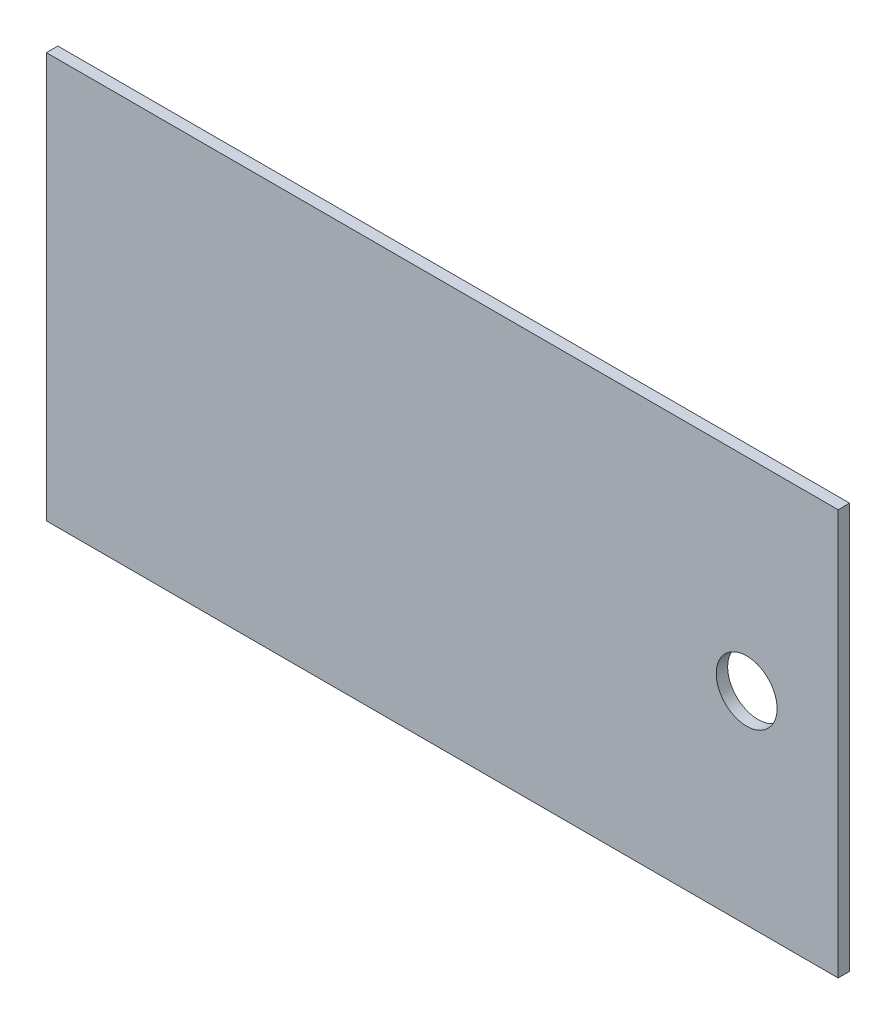
ISO-10303-21;
HEADER;
FILE_DESCRIPTION(('STEP AP214'),'2;1');
FILE_NAME('part.step','',(''),(''),'','','');
FILE_SCHEMA(('AUTOMOTIVE_DESIGN { 1 0 10303 214 1 1 1 1 }'));
ENDSEC;
DATA;
#1=APPLICATION_CONTEXT('core data for automotive mechanical design processes');
#2=APPLICATION_PROTOCOL_DEFINITION('international standard','automotive_design',2000,#1);
#3=PRODUCT_CONTEXT('',#1,'mechanical');
#4=PRODUCT('Part','Part','',(#3));
#5=PRODUCT_RELATED_PRODUCT_CATEGORY('part','',(#4));
#6=PRODUCT_DEFINITION_FORMATION('','',#4);
#7=PRODUCT_DEFINITION_CONTEXT('part definition',#1,'design');
#8=PRODUCT_DEFINITION('design','',#6,#7);
#9=PRODUCT_DEFINITION_SHAPE('','',#8);
#10=(LENGTH_UNIT() NAMED_UNIT(*) SI_UNIT(.MILLI.,.METRE.));
#11=(NAMED_UNIT(*) PLANE_ANGLE_UNIT() SI_UNIT($,.RADIAN.));
#12=(NAMED_UNIT(*) SI_UNIT($,.STERADIAN.) SOLID_ANGLE_UNIT());
#13=UNCERTAINTY_MEASURE_WITH_UNIT(LENGTH_MEASURE(1.E-05),#10,'distance_accuracy_value','');
#14=(GEOMETRIC_REPRESENTATION_CONTEXT(3) GLOBAL_UNCERTAINTY_ASSIGNED_CONTEXT((#13)) GLOBAL_UNIT_ASSIGNED_CONTEXT((#10,
#11,#12)) REPRESENTATION_CONTEXT('',''));
#15=CARTESIAN_POINT('',(0.,0.,0.));
#16=DIRECTION('',(0.,0.,1.));
#17=DIRECTION('',(1.,0.,0.));
#18=AXIS2_PLACEMENT_3D('',#15,#16,#17);
#19=CARTESIAN_POINT('',(-161.397494343139,-62.3625216291761,2.5));
#20=DIRECTION('',(0.,1.,0.));
#21=DIRECTION('',(0.,0.,1.));
#22=AXIS2_PLACEMENT_3D('',#19,#20,#21);
#23=PLANE('',#22);
#24=DIRECTION('',(1.,0.,0.));
#25=VECTOR('',#24,1.);
#26=CARTESIAN_POINT('',(-161.397494343139,-62.3625216291761,0.));
#27=LINE('',#26,#25);
#28=CARTESIAN_POINT('',(-161.397494343139,-62.3625216291761,0.));
#29=VERTEX_POINT('',#28);
#30=CARTESIAN_POINT('',(11.6025056568615,-62.3625216291761,0.));
#31=VERTEX_POINT('',#30);
#32=EDGE_CURVE('E99',#29,#31,#27,.T.);
#33=ORIENTED_EDGE('',*,*,#32,.T.);
#34=DIRECTION('',(0.,0.,-1.));
#35=VECTOR('',#34,1.);
#36=CARTESIAN_POINT('',(11.6025056568615,-62.3625216291761,2.5));
#37=LINE('',#36,#35);
#38=CARTESIAN_POINT('',(11.6025056568615,-62.3625216291761,2.5));
#39=VERTEX_POINT('',#38);
#40=EDGE_CURVE('E11',#39,#31,#37,.T.);
#41=ORIENTED_EDGE('',*,*,#40,.F.);
#42=DIRECTION('',(1.,0.,0.));
#43=VECTOR('',#42,1.);
#44=CARTESIAN_POINT('',(-161.397494343139,-62.3625216291761,2.5));
#45=LINE('',#44,#43);
#46=CARTESIAN_POINT('',(-161.397494343139,-62.3625216291761,2.5));
#47=VERTEX_POINT('',#46);
#48=EDGE_CURVE('E75',#47,#39,#45,.T.);
#49=ORIENTED_EDGE('',*,*,#48,.F.);
#50=DIRECTION('',(0.,0.,-1.));
#51=VECTOR('',#50,1.);
#52=CARTESIAN_POINT('',(-161.397494343139,-62.3625216291761,2.5));
#53=LINE('',#52,#51);
#54=EDGE_CURVE('E95',#47,#29,#53,.T.);
#55=ORIENTED_EDGE('',*,*,#54,.T.);
#56=EDGE_LOOP('',(#33,#41,#49,#55));
#57=FACE_BOUND('',#56,.T.);
#58=ADVANCED_FACE('F35',(#57),#23,.F.);
#59=CARTESIAN_POINT('',(11.6025056568615,26.2374783708239,2.5));
#60=DIRECTION('',(1.,0.,0.));
#61=DIRECTION('',(0.,1.,0.));
#62=AXIS2_PLACEMENT_3D('',#59,#60,#61);
#63=PLANE('',#62);
#64=DIRECTION('',(0.,-1.,0.));
#65=VECTOR('',#64,1.);
#66=CARTESIAN_POINT('',(11.6025056568615,26.2374783708239,0.));
#67=LINE('',#66,#65);
#68=CARTESIAN_POINT('',(11.6025056568615,26.2374783708239,0.));
#69=VERTEX_POINT('',#68);
#70=EDGE_CURVE('E84',#69,#31,#67,.T.);
#71=ORIENTED_EDGE('',*,*,#70,.F.);
#72=DIRECTION('',(0.,0.,-1.));
#73=VECTOR('',#72,1.);
#74=CARTESIAN_POINT('',(11.6025056568615,26.2374783708239,2.5));
#75=LINE('',#74,#73);
#76=CARTESIAN_POINT('',(11.6025056568615,26.2374783708239,2.5));
#77=VERTEX_POINT('',#76);
#78=EDGE_CURVE('E44',#77,#69,#75,.T.);
#79=ORIENTED_EDGE('',*,*,#78,.F.);
#80=DIRECTION('',(0.,-1.,0.));
#81=VECTOR('',#80,1.);
#82=CARTESIAN_POINT('',(11.6025056568615,26.2374783708239,2.5));
#83=LINE('',#82,#81);
#84=EDGE_CURVE('E82',#77,#39,#83,.T.);
#85=ORIENTED_EDGE('',*,*,#84,.T.);
#86=ORIENTED_EDGE('',*,*,#40,.T.);
#87=EDGE_LOOP('',(#71,#79,#85,#86));
#88=FACE_BOUND('',#87,.T.);
#89=ADVANCED_FACE('F81',(#88),#63,.T.);
#90=CARTESIAN_POINT('',(-161.397494343139,26.2374783708239,2.5));
#91=DIRECTION('',(0.,1.,0.));
#92=DIRECTION('',(0.,0.,1.));
#93=AXIS2_PLACEMENT_3D('',#90,#91,#92);
#94=PLANE('',#93);
#95=DIRECTION('',(1.,0.,0.));
#96=VECTOR('',#95,1.);
#97=CARTESIAN_POINT('',(-161.397494343139,26.2374783708239,0.));
#98=LINE('',#97,#96);
#99=CARTESIAN_POINT('',(-161.397494343139,26.2374783708239,0.));
#100=VERTEX_POINT('',#99);
#101=EDGE_CURVE('E103',#100,#69,#98,.T.);
#102=ORIENTED_EDGE('',*,*,#101,.F.);
#103=DIRECTION('',(0.,0.,-1.));
#104=VECTOR('',#103,1.);
#105=CARTESIAN_POINT('',(-161.397494343139,26.2374783708239,2.5));
#106=LINE('',#105,#104);
#107=CARTESIAN_POINT('',(-161.397494343139,26.2374783708239,2.5));
#108=VERTEX_POINT('',#107);
#109=EDGE_CURVE('E67',#108,#100,#106,.T.);
#110=ORIENTED_EDGE('',*,*,#109,.F.);
#111=DIRECTION('',(1.,0.,0.));
#112=VECTOR('',#111,1.);
#113=CARTESIAN_POINT('',(-161.397494343139,26.2374783708239,2.5));
#114=LINE('',#113,#112);
#115=EDGE_CURVE('E91',#108,#77,#114,.T.);
#116=ORIENTED_EDGE('',*,*,#115,.T.);
#117=ORIENTED_EDGE('',*,*,#78,.T.);
#118=EDGE_LOOP('',(#102,#110,#116,#117));
#119=FACE_BOUND('',#118,.T.);
#120=ADVANCED_FACE('F93',(#119),#94,.T.);
#121=CARTESIAN_POINT('',(-161.397494343139,26.2374783708239,2.5));
#122=DIRECTION('',(1.,0.,0.));
#123=DIRECTION('',(0.,0.,-1.));
#124=AXIS2_PLACEMENT_3D('',#121,#122,#123);
#125=PLANE('',#124);
#126=DIRECTION('',(0.,-1.,0.));
#127=VECTOR('',#126,1.);
#128=CARTESIAN_POINT('',(-161.397494343139,26.2374783708239,0.));
#129=LINE('',#128,#127);
#130=EDGE_CURVE('E70',#100,#29,#129,.T.);
#131=ORIENTED_EDGE('',*,*,#130,.T.);
#132=ORIENTED_EDGE('',*,*,#54,.F.);
#133=DIRECTION('',(0.,-1.,0.));
#134=VECTOR('',#133,1.);
#135=CARTESIAN_POINT('',(-161.397494343139,26.2374783708239,2.5));
#136=LINE('',#135,#134);
#137=EDGE_CURVE('E52',#108,#47,#136,.T.);
#138=ORIENTED_EDGE('',*,*,#137,.F.);
#139=ORIENTED_EDGE('',*,*,#109,.T.);
#140=EDGE_LOOP('',(#131,#132,#138,#139));
#141=FACE_BOUND('',#140,.T.);
#142=ADVANCED_FACE('F121',(#141),#125,.F.);
#143=CARTESIAN_POINT('',(0.,0.,2.5));
#144=DIRECTION('',(0.,0.,-1.));
#145=DIRECTION('',(-1.,0.,0.));
#146=AXIS2_PLACEMENT_3D('',#143,#144,#145);
#147=PLANE('',#146);
#148=CARTESIAN_POINT('',(-8.39749434313854,-18.0625216291761,2.5));
#149=DIRECTION('',(0.,0.,1.));
#150=DIRECTION('',(1.,0.,0.));
#151=AXIS2_PLACEMENT_3D('',#148,#149,#150);
#152=CIRCLE('',#151,6.65);
#153=CARTESIAN_POINT('',(-1.74749434313854,-18.0625216291761,2.5));
#154=VERTEX_POINT('',#153);
#155=EDGE_CURVE('E172',#154,#154,#152,.T.);
#156=ORIENTED_EDGE('',*,*,#155,.F.);
#157=EDGE_LOOP('',(#156));
#158=FACE_BOUND('',#157,.T.);
#159=ORIENTED_EDGE('',*,*,#48,.T.);
#160=ORIENTED_EDGE('',*,*,#84,.F.);
#161=ORIENTED_EDGE('',*,*,#115,.F.);
#162=ORIENTED_EDGE('',*,*,#137,.T.);
#163=EDGE_LOOP('',(#159,#160,#161,#162));
#164=FACE_BOUND('',#163,.T.);
#165=ADVANCED_FACE('F90',(#158,#164),#147,.F.);
#166=CARTESIAN_POINT('',(0.,0.,0.));
#167=DIRECTION('',(0.,0.,-1.));
#168=DIRECTION('',(-1.,0.,0.));
#169=AXIS2_PLACEMENT_3D('',#166,#167,#168);
#170=PLANE('',#169);
#171=CARTESIAN_POINT('',(-8.39749434313854,-18.0625216291761,0.));
#172=DIRECTION('',(0.,0.,-1.));
#173=DIRECTION('',(-1.,0.,0.));
#174=AXIS2_PLACEMENT_3D('',#171,#172,#173);
#175=CIRCLE('',#174,6.65);
#176=CARTESIAN_POINT('',(-15.0474943431385,-18.0625216291761,0.));
#177=VERTEX_POINT('',#176);
#178=EDGE_CURVE('E38',#177,#177,#175,.T.);
#179=ORIENTED_EDGE('',*,*,#178,.F.);
#180=EDGE_LOOP('',(#179));
#181=FACE_BOUND('',#180,.T.);
#182=ORIENTED_EDGE('',*,*,#32,.F.);
#183=ORIENTED_EDGE('',*,*,#130,.F.);
#184=ORIENTED_EDGE('',*,*,#101,.T.);
#185=ORIENTED_EDGE('',*,*,#70,.T.);
#186=EDGE_LOOP('',(#182,#183,#184,#185));
#187=FACE_BOUND('',#186,.T.);
#188=ADVANCED_FACE('F110',(#181,#187),#170,.T.);
#189=CARTESIAN_POINT('',(-8.39749434313854,-18.0625216291761,-7.5));
#190=DIRECTION('',(0.,0.,1.));
#191=DIRECTION('',(1.,0.,0.));
#192=AXIS2_PLACEMENT_3D('',#189,#190,#191);
#193=CYLINDRICAL_SURFACE('',#192,6.65);
#194=ORIENTED_EDGE('',*,*,#178,.T.);
#195=EDGE_LOOP('',(#194));
#196=FACE_BOUND('',#195,.T.);
#197=ORIENTED_EDGE('',*,*,#155,.T.);
#198=EDGE_LOOP('',(#197));
#199=FACE_BOUND('',#198,.T.);
#200=ADVANCED_FACE('F112',(#196,#199),#193,.F.);
#201=CLOSED_SHELL('',(#58,#89,#120,#142,#165,#188,#200));
#202=MANIFOLD_SOLID_BREP('B2',#201);
#203=ADVANCED_BREP_SHAPE_REPRESENTATION('',(#18,#202),#14);
#204=SHAPE_DEFINITION_REPRESENTATION(#9,#203);
ENDSEC;
END-ISO-10303-21;
